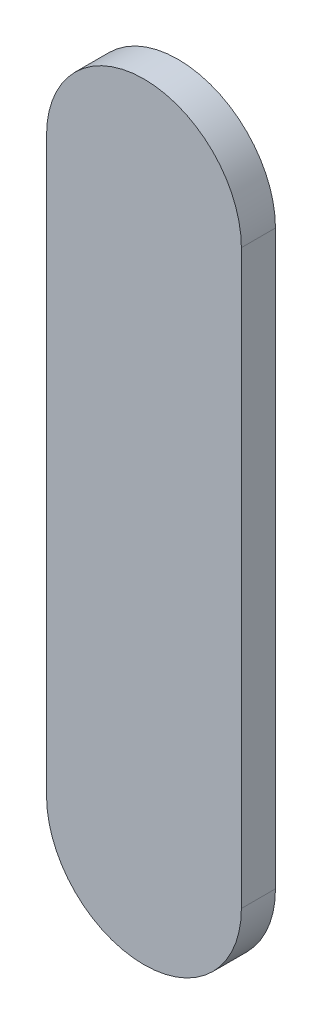
ISO-10303-21;
HEADER;
FILE_DESCRIPTION(('STEP AP214'),'2;1');
FILE_NAME('part.step','',(''),(''),'','','');
FILE_SCHEMA(('AUTOMOTIVE_DESIGN { 1 0 10303 214 1 1 1 1 }'));
ENDSEC;
DATA;
#1=APPLICATION_CONTEXT('core data for automotive mechanical design processes');
#2=APPLICATION_PROTOCOL_DEFINITION('international standard','automotive_design',2000,#1);
#3=PRODUCT_CONTEXT('',#1,'mechanical');
#4=PRODUCT('Part','Part','',(#3));
#5=PRODUCT_RELATED_PRODUCT_CATEGORY('part','',(#4));
#6=PRODUCT_DEFINITION_FORMATION('','',#4);
#7=PRODUCT_DEFINITION_CONTEXT('part definition',#1,'design');
#8=PRODUCT_DEFINITION('design','',#6,#7);
#9=PRODUCT_DEFINITION_SHAPE('','',#8);
#10=(LENGTH_UNIT() NAMED_UNIT(*) SI_UNIT(.MILLI.,.METRE.));
#11=(NAMED_UNIT(*) PLANE_ANGLE_UNIT() SI_UNIT($,.RADIAN.));
#12=(NAMED_UNIT(*) SI_UNIT($,.STERADIAN.) SOLID_ANGLE_UNIT());
#13=UNCERTAINTY_MEASURE_WITH_UNIT(LENGTH_MEASURE(1.E-05),#10,'distance_accuracy_value','');
#14=(GEOMETRIC_REPRESENTATION_CONTEXT(3) GLOBAL_UNCERTAINTY_ASSIGNED_CONTEXT((#13)) GLOBAL_UNIT_ASSIGNED_CONTEXT((#10,
#11,#12)) REPRESENTATION_CONTEXT('',''));
#15=CARTESIAN_POINT('',(0.,0.,0.));
#16=DIRECTION('',(0.,0.,1.));
#17=DIRECTION('',(1.,0.,0.));
#18=AXIS2_PLACEMENT_3D('',#15,#16,#17);
#19=CARTESIAN_POINT('',(84.05,-109.4625,1.635));
#20=DIRECTION('',(0.,0.,1.));
#21=DIRECTION('',(1.,0.,0.));
#22=AXIS2_PLACEMENT_3D('',#19,#20,#21);
#23=PLANE('',#22);
#24=DIRECTION('',(0.,1.,0.));
#25=VECTOR('',#24,1.);
#26=CARTESIAN_POINT('',(84.05,-109.4625,1.635));
#27=LINE('',#26,#25);
#28=CARTESIAN_POINT('',(84.05,-109.4625,1.635));
#29=VERTEX_POINT('',#28);
#30=CARTESIAN_POINT('',(84.05,-108.875,1.635));
#31=VERTEX_POINT('',#30);
#32=EDGE_CURVE('E82',#29,#31,#27,.T.);
#33=ORIENTED_EDGE('',*,*,#32,.T.);
#34=CARTESIAN_POINT('',(83.95,-108.875,1.635));
#35=DIRECTION('',(0.,0.,1.));
#36=DIRECTION('',(1.,0.,0.));
#37=AXIS2_PLACEMENT_3D('',#34,#35,#36);
#38=CIRCLE('',#37,0.1);
#39=CARTESIAN_POINT('',(83.85,-108.875,1.635));
#40=VERTEX_POINT('',#39);
#41=EDGE_CURVE('E109',#31,#40,#38,.T.);
#42=ORIENTED_EDGE('',*,*,#41,.T.);
#43=DIRECTION('',(0.,-1.,0.));
#44=VECTOR('',#43,1.);
#45=CARTESIAN_POINT('',(83.85,-108.875,1.635));
#46=LINE('',#45,#44);
#47=CARTESIAN_POINT('',(83.85,-109.4625,1.635));
#48=VERTEX_POINT('',#47);
#49=EDGE_CURVE('E75',#40,#48,#46,.T.);
#50=ORIENTED_EDGE('',*,*,#49,.T.);
#51=CARTESIAN_POINT('',(83.95,-109.4625,1.635));
#52=DIRECTION('',(0.,0.,1.));
#53=DIRECTION('',(-1.,0.,0.));
#54=AXIS2_PLACEMENT_3D('',#51,#52,#53);
#55=CIRCLE('',#54,0.1);
#56=EDGE_CURVE('E11',#48,#29,#55,.T.);
#57=ORIENTED_EDGE('',*,*,#56,.T.);
#58=EDGE_LOOP('',(#33,#42,#50,#57));
#59=FACE_BOUND('',#58,.T.);
#60=ADVANCED_FACE('F17',(#59),#23,.T.);
#61=CARTESIAN_POINT('',(84.05,-109.4625,1.6));
#62=DIRECTION('',(0.,0.,1.));
#63=DIRECTION('',(1.,0.,0.));
#64=AXIS2_PLACEMENT_3D('',#61,#62,#63);
#65=PLANE('',#64);
#66=CARTESIAN_POINT('',(83.95,-109.4625,1.6));
#67=DIRECTION('',(0.,0.,1.));
#68=DIRECTION('',(-1.,0.,0.));
#69=AXIS2_PLACEMENT_3D('',#66,#67,#68);
#70=CIRCLE('',#69,0.1);
#71=CARTESIAN_POINT('',(83.85,-109.4625,1.6));
#72=VERTEX_POINT('',#71);
#73=CARTESIAN_POINT('',(84.05,-109.4625,1.6));
#74=VERTEX_POINT('',#73);
#75=EDGE_CURVE('E20',#72,#74,#70,.T.);
#76=ORIENTED_EDGE('',*,*,#75,.F.);
#77=DIRECTION('',(0.,-1.,0.));
#78=VECTOR('',#77,1.);
#79=CARTESIAN_POINT('',(83.85,-108.875,1.6));
#80=LINE('',#79,#78);
#81=CARTESIAN_POINT('',(83.85,-108.875,1.6));
#82=VERTEX_POINT('',#81);
#83=EDGE_CURVE('E102',#82,#72,#80,.T.);
#84=ORIENTED_EDGE('',*,*,#83,.F.);
#85=CARTESIAN_POINT('',(83.95,-108.875,1.6));
#86=DIRECTION('',(0.,0.,1.));
#87=DIRECTION('',(1.,0.,0.));
#88=AXIS2_PLACEMENT_3D('',#85,#86,#87);
#89=CIRCLE('',#88,0.1);
#90=CARTESIAN_POINT('',(84.05,-108.875,1.6));
#91=VERTEX_POINT('',#90);
#92=EDGE_CURVE('E84',#91,#82,#89,.T.);
#93=ORIENTED_EDGE('',*,*,#92,.F.);
#94=DIRECTION('',(0.,1.,0.));
#95=VECTOR('',#94,1.);
#96=CARTESIAN_POINT('',(84.05,-109.4625,1.6));
#97=LINE('',#96,#95);
#98=EDGE_CURVE('E80',#74,#91,#97,.T.);
#99=ORIENTED_EDGE('',*,*,#98,.F.);
#100=EDGE_LOOP('',(#76,#84,#93,#99));
#101=FACE_BOUND('',#100,.T.);
#102=ADVANCED_FACE('F86',(#101),#65,.F.);
#103=CARTESIAN_POINT('',(83.95,-109.4625,1.6));
#104=DIRECTION('',(0.,0.,-1.));
#105=DIRECTION('',(-1.,0.,0.));
#106=AXIS2_PLACEMENT_3D('',#103,#104,#105);
#107=CYLINDRICAL_SURFACE('',#106,0.1);
#108=ORIENTED_EDGE('',*,*,#75,.T.);
#109=DIRECTION('',(0.,0.,1.));
#110=VECTOR('',#109,1.);
#111=CARTESIAN_POINT('',(84.05,-109.4625,1.6));
#112=LINE('',#111,#110);
#113=EDGE_CURVE('E69',#74,#29,#112,.T.);
#114=ORIENTED_EDGE('',*,*,#113,.T.);
#115=ORIENTED_EDGE('',*,*,#56,.F.);
#116=DIRECTION('',(0.,0.,1.));
#117=VECTOR('',#116,1.);
#118=CARTESIAN_POINT('',(83.85,-109.4625,1.6));
#119=LINE('',#118,#117);
#120=EDGE_CURVE('E72',#72,#48,#119,.T.);
#121=ORIENTED_EDGE('',*,*,#120,.F.);
#122=EDGE_LOOP('',(#108,#114,#115,#121));
#123=FACE_BOUND('',#122,.T.);
#124=ADVANCED_FACE('F68',(#123),#107,.T.);
#125=CARTESIAN_POINT('',(83.85,-108.875,1.6));
#126=DIRECTION('',(1.,0.,0.));
#127=DIRECTION('',(0.,1.,0.));
#128=AXIS2_PLACEMENT_3D('',#125,#126,#127);
#129=PLANE('',#128);
#130=ORIENTED_EDGE('',*,*,#83,.T.);
#131=ORIENTED_EDGE('',*,*,#120,.T.);
#132=ORIENTED_EDGE('',*,*,#49,.F.);
#133=DIRECTION('',(0.,0.,1.));
#134=VECTOR('',#133,1.);
#135=CARTESIAN_POINT('',(83.85,-108.875,1.6));
#136=LINE('',#135,#134);
#137=EDGE_CURVE('E105',#82,#40,#136,.T.);
#138=ORIENTED_EDGE('',*,*,#137,.F.);
#139=EDGE_LOOP('',(#130,#131,#132,#138));
#140=FACE_BOUND('',#139,.T.);
#141=ADVANCED_FACE('F120',(#140),#129,.F.);
#142=CARTESIAN_POINT('',(83.95,-108.875,1.6));
#143=DIRECTION('',(0.,0.,-1.));
#144=DIRECTION('',(1.,0.,0.));
#145=AXIS2_PLACEMENT_3D('',#142,#143,#144);
#146=CYLINDRICAL_SURFACE('',#145,0.1);
#147=ORIENTED_EDGE('',*,*,#92,.T.);
#148=ORIENTED_EDGE('',*,*,#137,.T.);
#149=ORIENTED_EDGE('',*,*,#41,.F.);
#150=DIRECTION('',(0.,0.,1.));
#151=VECTOR('',#150,1.);
#152=CARTESIAN_POINT('',(84.05,-108.875,1.6));
#153=LINE('',#152,#151);
#154=EDGE_CURVE('E90',#91,#31,#153,.T.);
#155=ORIENTED_EDGE('',*,*,#154,.F.);
#156=EDGE_LOOP('',(#147,#148,#149,#155));
#157=FACE_BOUND('',#156,.T.);
#158=ADVANCED_FACE('F122',(#157),#146,.T.);
#159=CARTESIAN_POINT('',(84.05,-109.4625,1.6));
#160=DIRECTION('',(-1.,0.,0.));
#161=DIRECTION('',(0.,0.,1.));
#162=AXIS2_PLACEMENT_3D('',#159,#160,#161);
#163=PLANE('',#162);
#164=ORIENTED_EDGE('',*,*,#98,.T.);
#165=ORIENTED_EDGE('',*,*,#154,.T.);
#166=ORIENTED_EDGE('',*,*,#32,.F.);
#167=ORIENTED_EDGE('',*,*,#113,.F.);
#168=EDGE_LOOP('',(#164,#165,#166,#167));
#169=FACE_BOUND('',#168,.T.);
#170=ADVANCED_FACE('F78',(#169),#163,.F.);
#171=CLOSED_SHELL('',(#60,#102,#124,#141,#158,#170));
#172=MANIFOLD_SOLID_BREP('B1',#171);
#173=ADVANCED_BREP_SHAPE_REPRESENTATION('',(#18,#172),#14);
#174=SHAPE_DEFINITION_REPRESENTATION(#9,#173);
ENDSEC;
END-ISO-10303-21;
